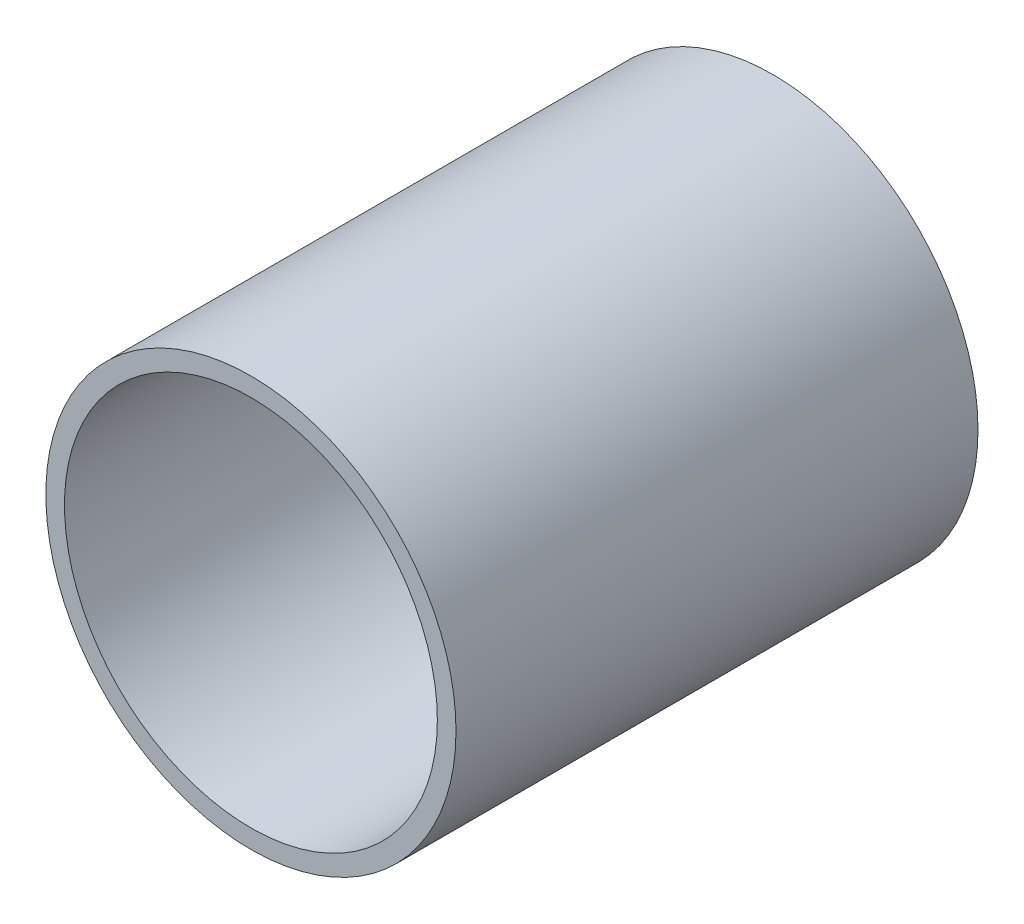
ISO-10303-21;
HEADER;
FILE_DESCRIPTION(('STEP AP214'),'2;1');
FILE_NAME('part.step','',(''),(''),'','','');
FILE_SCHEMA(('AUTOMOTIVE_DESIGN { 1 0 10303 214 1 1 1 1 }'));
ENDSEC;
DATA;
#1=APPLICATION_CONTEXT('core data for automotive mechanical design processes');
#2=APPLICATION_PROTOCOL_DEFINITION('international standard','automotive_design',2000,#1);
#3=PRODUCT_CONTEXT('',#1,'mechanical');
#4=PRODUCT('Part','Part','',(#3));
#5=PRODUCT_RELATED_PRODUCT_CATEGORY('part','',(#4));
#6=PRODUCT_DEFINITION_FORMATION('','',#4);
#7=PRODUCT_DEFINITION_CONTEXT('part definition',#1,'design');
#8=PRODUCT_DEFINITION('design','',#6,#7);
#9=PRODUCT_DEFINITION_SHAPE('','',#8);
#10=(LENGTH_UNIT() NAMED_UNIT(*) SI_UNIT(.MILLI.,.METRE.));
#11=(NAMED_UNIT(*) PLANE_ANGLE_UNIT() SI_UNIT($,.RADIAN.));
#12=(NAMED_UNIT(*) SI_UNIT($,.STERADIAN.) SOLID_ANGLE_UNIT());
#13=UNCERTAINTY_MEASURE_WITH_UNIT(LENGTH_MEASURE(1.E-05),#10,'distance_accuracy_value','');
#14=(GEOMETRIC_REPRESENTATION_CONTEXT(3) GLOBAL_UNCERTAINTY_ASSIGNED_CONTEXT((#13)) GLOBAL_UNIT_ASSIGNED_CONTEXT((#10,
#11,#12)) REPRESENTATION_CONTEXT('',''));
#15=CARTESIAN_POINT('',(0.,0.,0.));
#16=DIRECTION('',(0.,0.,1.));
#17=DIRECTION('',(1.,0.,0.));
#18=AXIS2_PLACEMENT_3D('',#15,#16,#17);
#19=CARTESIAN_POINT('',(0.,0.,0.));
#20=DIRECTION('',(0.,0.,1.));
#21=DIRECTION('',(1.,0.,0.));
#22=AXIS2_PLACEMENT_3D('',#19,#20,#21);
#23=CYLINDRICAL_SURFACE('',#22,25.4);
#24=CARTESIAN_POINT('',(0.,0.,0.));
#25=DIRECTION('',(0.,0.,1.));
#26=DIRECTION('',(1.,0.,0.));
#27=AXIS2_PLACEMENT_3D('',#24,#25,#26);
#28=CIRCLE('',#27,25.4);
#29=CARTESIAN_POINT('',(25.4,0.,0.));
#30=VERTEX_POINT('',#29);
#31=EDGE_CURVE('E56',#30,#30,#28,.T.);
#32=ORIENTED_EDGE('',*,*,#31,.F.);
#33=EDGE_LOOP('',(#32));
#34=FACE_BOUND('',#33,.T.);
#35=CARTESIAN_POINT('',(0.,0.,12.7));
#36=DIRECTION('',(0.,0.,1.));
#37=DIRECTION('',(1.,0.,0.));
#38=AXIS2_PLACEMENT_3D('',#35,#36,#37);
#39=CIRCLE('',#38,25.4);
#40=CARTESIAN_POINT('',(25.4,0.,12.7));
#41=VERTEX_POINT('',#40);
#42=EDGE_CURVE('E45',#41,#41,#39,.F.);
#43=ORIENTED_EDGE('',*,*,#42,.F.);
#44=EDGE_LOOP('',(#43));
#45=FACE_BOUND('',#44,.T.);
#46=ADVANCED_FACE('F41',(#34,#45),#23,.F.);
#47=CARTESIAN_POINT('',(0.,0.,177.8));
#48=DIRECTION('',(0.,0.,-1.));
#49=DIRECTION('',(-1.,0.,0.));
#50=AXIS2_PLACEMENT_3D('',#47,#48,#49);
#51=CYLINDRICAL_SURFACE('',#50,69.85);
#52=CARTESIAN_POINT('',(0.,0.,177.8));
#53=DIRECTION('',(0.,0.,1.));
#54=DIRECTION('',(1.,0.,0.));
#55=AXIS2_PLACEMENT_3D('',#52,#53,#54);
#56=CIRCLE('',#55,69.85);
#57=CARTESIAN_POINT('',(69.85,0.,177.8));
#58=VERTEX_POINT('',#57);
#59=EDGE_CURVE('E10',#58,#58,#56,.T.);
#60=ORIENTED_EDGE('',*,*,#59,.F.);
#61=EDGE_LOOP('',(#60));
#62=FACE_BOUND('',#61,.T.);
#63=CARTESIAN_POINT('',(0.,0.,0.));
#64=DIRECTION('',(0.,0.,1.));
#65=DIRECTION('',(1.,0.,0.));
#66=AXIS2_PLACEMENT_3D('',#63,#64,#65);
#67=CIRCLE('',#66,69.85);
#68=CARTESIAN_POINT('',(69.85,0.,0.));
#69=VERTEX_POINT('',#68);
#70=EDGE_CURVE('E50',#69,#69,#67,.T.);
#71=ORIENTED_EDGE('',*,*,#70,.T.);
#72=EDGE_LOOP('',(#71));
#73=FACE_BOUND('',#72,.T.);
#74=ADVANCED_FACE('F43',(#62,#73),#51,.T.);
#75=CARTESIAN_POINT('',(0.,0.,177.8));
#76=DIRECTION('',(0.,0.,1.));
#77=DIRECTION('',(1.,0.,0.));
#78=AXIS2_PLACEMENT_3D('',#75,#76,#77);
#79=PLANE('',#78);
#80=CARTESIAN_POINT('',(0.,0.,177.8));
#81=DIRECTION('',(0.,0.,1.));
#82=DIRECTION('',(1.,0.,0.));
#83=AXIS2_PLACEMENT_3D('',#80,#81,#82);
#84=CIRCLE('',#83,63.5);
#85=CARTESIAN_POINT('',(63.5,0.,177.8));
#86=VERTEX_POINT('',#85);
#87=EDGE_CURVE('E61',#86,#86,#84,.T.);
#88=ORIENTED_EDGE('',*,*,#87,.F.);
#89=EDGE_LOOP('',(#88));
#90=FACE_BOUND('',#89,.T.);
#91=ORIENTED_EDGE('',*,*,#59,.T.);
#92=EDGE_LOOP('',(#91));
#93=FACE_BOUND('',#92,.T.);
#94=ADVANCED_FACE('F82',(#90,#93),#79,.T.);
#95=CARTESIAN_POINT('',(0.,0.,0.));
#96=DIRECTION('',(0.,0.,1.));
#97=DIRECTION('',(1.,0.,0.));
#98=AXIS2_PLACEMENT_3D('',#95,#96,#97);
#99=PLANE('',#98);
#100=ORIENTED_EDGE('',*,*,#31,.T.);
#101=EDGE_LOOP('',(#100));
#102=FACE_BOUND('',#101,.T.);
#103=ORIENTED_EDGE('',*,*,#70,.F.);
#104=EDGE_LOOP('',(#103));
#105=FACE_BOUND('',#104,.T.);
#106=ADVANCED_FACE('F90',(#102,#105),#99,.F.);
#107=CARTESIAN_POINT('',(0.,0.,12.7));
#108=DIRECTION('',(0.,0.,1.));
#109=DIRECTION('',(1.,0.,0.));
#110=AXIS2_PLACEMENT_3D('',#107,#108,#109);
#111=PLANE('',#110);
#112=CARTESIAN_POINT('',(0.,0.,12.7));
#113=DIRECTION('',(0.,0.,1.));
#114=DIRECTION('',(1.,0.,0.));
#115=AXIS2_PLACEMENT_3D('',#112,#113,#114);
#116=CIRCLE('',#115,63.5);
#117=CARTESIAN_POINT('',(63.5,0.,12.7));
#118=VERTEX_POINT('',#117);
#119=EDGE_CURVE('E65',#118,#118,#116,.T.);
#120=ORIENTED_EDGE('',*,*,#119,.T.);
#121=EDGE_LOOP('',(#120));
#122=FACE_BOUND('',#121,.T.);
#123=ORIENTED_EDGE('',*,*,#42,.T.);
#124=EDGE_LOOP('',(#123));
#125=FACE_BOUND('',#124,.T.);
#126=ADVANCED_FACE('F74',(#122,#125),#111,.T.);
#127=CARTESIAN_POINT('',(0.,0.,12.7));
#128=DIRECTION('',(0.,0.,1.));
#129=DIRECTION('',(1.,0.,0.));
#130=AXIS2_PLACEMENT_3D('',#127,#128,#129);
#131=CYLINDRICAL_SURFACE('',#130,63.5);
#132=ORIENTED_EDGE('',*,*,#119,.F.);
#133=EDGE_LOOP('',(#132));
#134=FACE_BOUND('',#133,.T.);
#135=ORIENTED_EDGE('',*,*,#87,.T.);
#136=EDGE_LOOP('',(#135));
#137=FACE_BOUND('',#136,.T.);
#138=ADVANCED_FACE('F87',(#134,#137),#131,.F.);
#139=CLOSED_SHELL('',(#46,#74,#94,#106,#126,#138));
#140=MANIFOLD_SOLID_BREP('B2',#139);
#141=ADVANCED_BREP_SHAPE_REPRESENTATION('',(#18,#140),#14);
#142=SHAPE_DEFINITION_REPRESENTATION(#9,#141);
ENDSEC;
END-ISO-10303-21;
